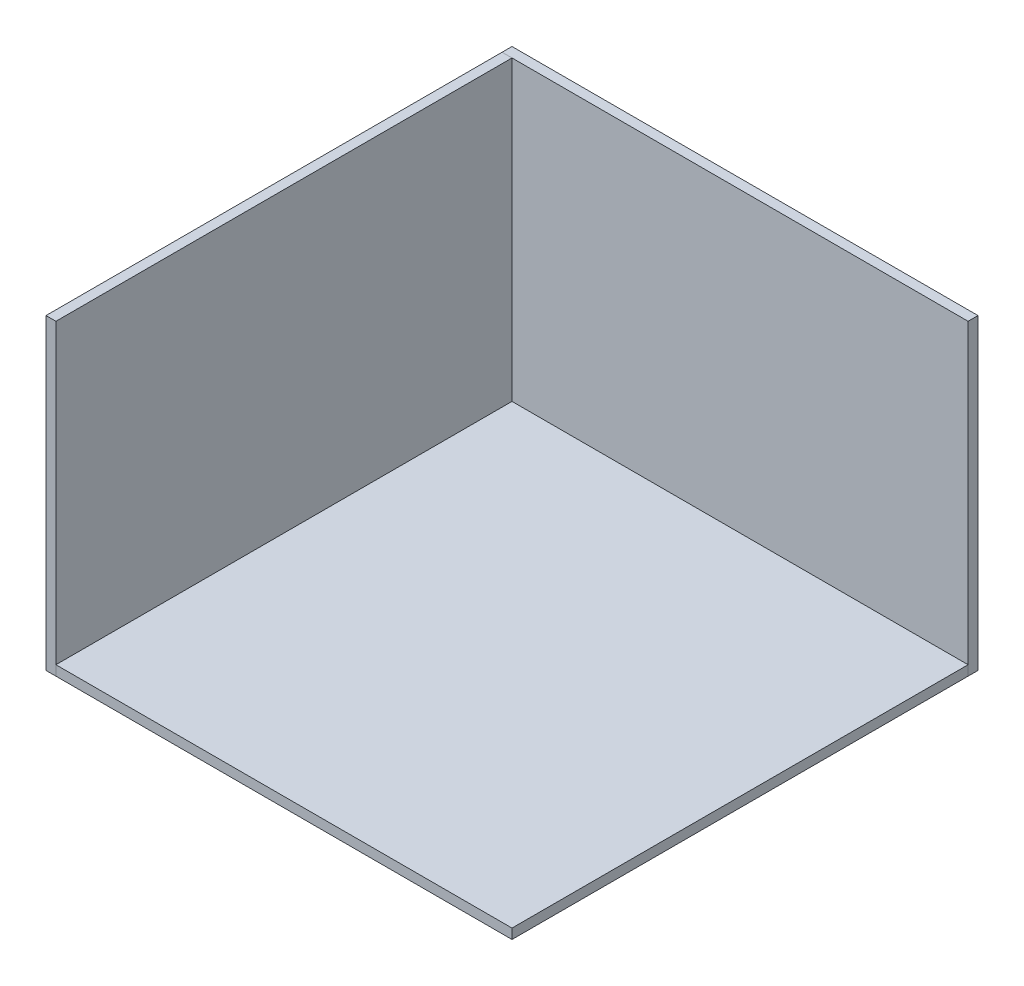
ISO-10303-21;
HEADER;
FILE_DESCRIPTION(('STEP AP214'),'2;1');
FILE_NAME('part.step','',(''),(''),'','','');
FILE_SCHEMA(('AUTOMOTIVE_DESIGN { 1 0 10303 214 1 1 1 1 }'));
ENDSEC;
DATA;
#1=APPLICATION_CONTEXT('core data for automotive mechanical design processes');
#2=APPLICATION_PROTOCOL_DEFINITION('international standard','automotive_design',2000,#1);
#3=PRODUCT_CONTEXT('',#1,'mechanical');
#4=PRODUCT('Part','Part','',(#3));
#5=PRODUCT_RELATED_PRODUCT_CATEGORY('part','',(#4));
#6=PRODUCT_DEFINITION_FORMATION('','',#4);
#7=PRODUCT_DEFINITION_CONTEXT('part definition',#1,'design');
#8=PRODUCT_DEFINITION('design','',#6,#7);
#9=PRODUCT_DEFINITION_SHAPE('','',#8);
#10=(LENGTH_UNIT() NAMED_UNIT(*) SI_UNIT(.MILLI.,.METRE.));
#11=(NAMED_UNIT(*) PLANE_ANGLE_UNIT() SI_UNIT($,.RADIAN.));
#12=(NAMED_UNIT(*) SI_UNIT($,.STERADIAN.) SOLID_ANGLE_UNIT());
#13=UNCERTAINTY_MEASURE_WITH_UNIT(LENGTH_MEASURE(1.E-05),#10,'distance_accuracy_value','');
#14=(GEOMETRIC_REPRESENTATION_CONTEXT(3) GLOBAL_UNCERTAINTY_ASSIGNED_CONTEXT((#13)) GLOBAL_UNIT_ASSIGNED_CONTEXT((#10,
#11,#12)) REPRESENTATION_CONTEXT('',''));
#15=CARTESIAN_POINT('',(0.,0.,0.));
#16=DIRECTION('',(0.,0.,1.));
#17=DIRECTION('',(1.,0.,0.));
#18=AXIS2_PLACEMENT_3D('',#15,#16,#17);
#19=CARTESIAN_POINT('',(-50.,1500.,0.));
#20=DIRECTION('',(-1.,0.,0.));
#21=DIRECTION('',(0.,0.,1.));
#22=AXIS2_PLACEMENT_3D('',#19,#20,#21);
#23=PLANE('',#22);
#24=DIRECTION('',(0.,0.,-1.));
#25=VECTOR('',#24,1.);
#26=CARTESIAN_POINT('',(-50.,-50.,0.));
#27=LINE('',#26,#25);
#28=CARTESIAN_POINT('',(-50.,-50.,2300.));
#29=VERTEX_POINT('',#28);
#30=CARTESIAN_POINT('',(-50.,-50.,0.));
#31=VERTEX_POINT('',#30);
#32=EDGE_CURVE('E109',#29,#31,#27,.T.);
#33=ORIENTED_EDGE('',*,*,#32,.F.);
#34=DIRECTION('',(0.,-1.,0.));
#35=VECTOR('',#34,1.);
#36=CARTESIAN_POINT('',(-50.,1500.,2300.));
#37=LINE('',#36,#35);
#38=CARTESIAN_POINT('',(-50.,1500.,2300.));
#39=VERTEX_POINT('',#38);
#40=EDGE_CURVE('E12',#39,#29,#37,.T.);
#41=ORIENTED_EDGE('',*,*,#40,.F.);
#42=DIRECTION('',(0.,0.,-1.));
#43=VECTOR('',#42,1.);
#44=CARTESIAN_POINT('',(-50.,1500.,0.));
#45=LINE('',#44,#43);
#46=CARTESIAN_POINT('',(-50.,1500.,0.));
#47=VERTEX_POINT('',#46);
#48=EDGE_CURVE('E103',#39,#47,#45,.T.);
#49=ORIENTED_EDGE('',*,*,#48,.T.);
#50=DIRECTION('',(0.,-1.,0.));
#51=VECTOR('',#50,1.);
#52=CARTESIAN_POINT('',(-50.,1500.,0.));
#53=LINE('',#52,#51);
#54=EDGE_CURVE('E48',#47,#31,#53,.T.);
#55=ORIENTED_EDGE('',*,*,#54,.T.);
#56=EDGE_LOOP('',(#33,#41,#49,#55));
#57=FACE_BOUND('',#56,.T.);
#58=ADVANCED_FACE('F45',(#57),#23,.T.);
#59=CARTESIAN_POINT('',(-50.,1500.,2300.));
#60=DIRECTION('',(0.,0.,1.));
#61=DIRECTION('',(1.,0.,0.));
#62=AXIS2_PLACEMENT_3D('',#59,#60,#61);
#63=PLANE('',#62);
#64=DIRECTION('',(-1.,0.,0.));
#65=VECTOR('',#64,1.);
#66=CARTESIAN_POINT('',(-50.,-50.,2300.));
#67=LINE('',#66,#65);
#68=CARTESIAN_POINT('',(2.81668763803891E-13,-50.,2300.));
#69=VERTEX_POINT('',#68);
#70=EDGE_CURVE('E105',#69,#29,#67,.T.);
#71=ORIENTED_EDGE('',*,*,#70,.F.);
#72=DIRECTION('',(0.,-1.,0.));
#73=VECTOR('',#72,1.);
#74=CARTESIAN_POINT('',(2.81668763803891E-13,1500.,2300.));
#75=LINE('',#74,#73);
#76=CARTESIAN_POINT('',(2.81668763803891E-13,1500.,2300.));
#77=VERTEX_POINT('',#76);
#78=EDGE_CURVE('E54',#77,#69,#75,.T.);
#79=ORIENTED_EDGE('',*,*,#78,.F.);
#80=DIRECTION('',(-1.,0.,0.));
#81=VECTOR('',#80,1.);
#82=CARTESIAN_POINT('',(-50.,1500.,2300.));
#83=LINE('',#82,#81);
#84=EDGE_CURVE('E100',#77,#39,#83,.T.);
#85=ORIENTED_EDGE('',*,*,#84,.T.);
#86=ORIENTED_EDGE('',*,*,#40,.T.);
#87=EDGE_LOOP('',(#71,#79,#85,#86));
#88=FACE_BOUND('',#87,.T.);
#89=ADVANCED_FACE('F119',(#88),#63,.T.);
#90=CARTESIAN_POINT('',(2.44929359829471E-13,1500.,0.));
#91=DIRECTION('',(1.,0.,0.));
#92=DIRECTION('',(0.,0.,-1.));
#93=AXIS2_PLACEMENT_3D('',#90,#91,#92);
#94=PLANE('',#93);
#95=DIRECTION('',(0.,0.,1.));
#96=VECTOR('',#95,1.);
#97=CARTESIAN_POINT('',(2.44929359829471E-13,-50.,0.));
#98=LINE('',#97,#96);
#99=CARTESIAN_POINT('',(2.44929359829471E-13,-50.,0.));
#100=VERTEX_POINT('',#99);
#101=EDGE_CURVE('E95',#100,#69,#98,.T.);
#102=ORIENTED_EDGE('',*,*,#101,.F.);
#103=DIRECTION('',(0.,-1.,0.));
#104=VECTOR('',#103,1.);
#105=CARTESIAN_POINT('',(2.44929359829471E-13,1500.,0.));
#106=LINE('',#105,#104);
#107=CARTESIAN_POINT('',(2.44929359829471E-13,1500.,0.));
#108=VERTEX_POINT('',#107);
#109=EDGE_CURVE('E90',#108,#100,#106,.T.);
#110=ORIENTED_EDGE('',*,*,#109,.F.);
#111=DIRECTION('',(0.,0.,1.));
#112=VECTOR('',#111,1.);
#113=CARTESIAN_POINT('',(2.44929359829471E-13,1500.,0.));
#114=LINE('',#113,#112);
#115=EDGE_CURVE('E93',#108,#77,#114,.T.);
#116=ORIENTED_EDGE('',*,*,#115,.T.);
#117=ORIENTED_EDGE('',*,*,#78,.T.);
#118=EDGE_LOOP('',(#102,#110,#116,#117));
#119=FACE_BOUND('',#118,.T.);
#120=ADVANCED_FACE('F92',(#119),#94,.T.);
#121=CARTESIAN_POINT('',(-50.,1500.,0.));
#122=DIRECTION('',(0.,0.,-1.));
#123=DIRECTION('',(-1.,0.,0.));
#124=AXIS2_PLACEMENT_3D('',#121,#122,#123);
#125=PLANE('',#124);
#126=DIRECTION('',(1.,0.,0.));
#127=VECTOR('',#126,1.);
#128=CARTESIAN_POINT('',(-50.,-50.,0.));
#129=LINE('',#128,#127);
#130=EDGE_CURVE('E112',#31,#100,#129,.T.);
#131=ORIENTED_EDGE('',*,*,#130,.F.);
#132=ORIENTED_EDGE('',*,*,#54,.F.);
#133=DIRECTION('',(1.,0.,0.));
#134=VECTOR('',#133,1.);
#135=CARTESIAN_POINT('',(-50.,1500.,0.));
#136=LINE('',#135,#134);
#137=EDGE_CURVE('E99',#47,#108,#136,.T.);
#138=ORIENTED_EDGE('',*,*,#137,.T.);
#139=ORIENTED_EDGE('',*,*,#109,.T.);
#140=EDGE_LOOP('',(#131,#132,#138,#139));
#141=FACE_BOUND('',#140,.T.);
#142=ADVANCED_FACE('F102',(#141),#125,.T.);
#143=CARTESIAN_POINT('',(0.,1500.,0.));
#144=DIRECTION('',(0.,1.,0.));
#145=DIRECTION('',(0.,0.,1.));
#146=AXIS2_PLACEMENT_3D('',#143,#144,#145);
#147=PLANE('',#146);
#148=ORIENTED_EDGE('',*,*,#48,.F.);
#149=ORIENTED_EDGE('',*,*,#84,.F.);
#150=ORIENTED_EDGE('',*,*,#115,.F.);
#151=ORIENTED_EDGE('',*,*,#137,.F.);
#152=EDGE_LOOP('',(#148,#149,#150,#151));
#153=FACE_BOUND('',#152,.T.);
#154=ADVANCED_FACE('F98',(#153),#147,.T.);
#155=CARTESIAN_POINT('',(0.,-50.,0.));
#156=DIRECTION('',(0.,1.,0.));
#157=DIRECTION('',(0.,0.,1.));
#158=AXIS2_PLACEMENT_3D('',#155,#156,#157);
#159=PLANE('',#158);
#160=ORIENTED_EDGE('',*,*,#32,.T.);
#161=ORIENTED_EDGE('',*,*,#130,.T.);
#162=ORIENTED_EDGE('',*,*,#101,.T.);
#163=ORIENTED_EDGE('',*,*,#70,.T.);
#164=EDGE_LOOP('',(#160,#161,#162,#163));
#165=FACE_BOUND('',#164,.T.);
#166=ADVANCED_FACE('F118',(#165),#159,.F.);
#167=CLOSED_SHELL('',(#58,#89,#120,#142,#154,#166));
#168=MANIFOLD_SOLID_BREP('B2',#167);
#169=CARTESIAN_POINT('',(0.,1500.,0.));
#170=DIRECTION('',(0.,0.,1.));
#171=DIRECTION('',(1.,0.,0.));
#172=AXIS2_PLACEMENT_3D('',#169,#170,#171);
#173=PLANE('',#172);
#174=DIRECTION('',(-1.,0.,0.));
#175=VECTOR('',#174,1.);
#176=CARTESIAN_POINT('',(0.,-50.,0.));
#177=LINE('',#176,#175);
#178=CARTESIAN_POINT('',(2300.,-50.,0.));
#179=VERTEX_POINT('',#178);
#180=CARTESIAN_POINT('',(-50.,-50.,0.));
#181=VERTEX_POINT('',#180);
#182=EDGE_CURVE('E239',#179,#181,#177,.T.);
#183=ORIENTED_EDGE('',*,*,#182,.F.);
#184=DIRECTION('',(0.,-1.,0.));
#185=VECTOR('',#184,1.);
#186=CARTESIAN_POINT('',(2300.,1500.,0.));
#187=LINE('',#186,#185);
#188=CARTESIAN_POINT('',(2300.,1500.,0.));
#189=VERTEX_POINT('',#188);
#190=EDGE_CURVE('E43',#189,#179,#187,.T.);
#191=ORIENTED_EDGE('',*,*,#190,.F.);
#192=DIRECTION('',(-1.,0.,0.));
#193=VECTOR('',#192,1.);
#194=CARTESIAN_POINT('',(-50.,1500.,0.));
#195=LINE('',#194,#193);
#196=CARTESIAN_POINT('',(-50.,1500.,0.));
#197=VERTEX_POINT('',#196);
#198=EDGE_CURVE('E198',#189,#197,#195,.T.);
#199=ORIENTED_EDGE('',*,*,#198,.T.);
#200=DIRECTION('',(0.,-1.,0.));
#201=VECTOR('',#200,1.);
#202=CARTESIAN_POINT('',(-50.,1500.,0.));
#203=LINE('',#202,#201);
#204=EDGE_CURVE('E183',#197,#181,#203,.T.);
#205=ORIENTED_EDGE('',*,*,#204,.T.);
#206=EDGE_LOOP('',(#183,#191,#199,#205));
#207=FACE_BOUND('',#206,.T.);
#208=ADVANCED_FACE('F179',(#207),#173,.T.);
#209=CARTESIAN_POINT('',(2300.,1500.,0.));
#210=DIRECTION('',(1.,0.,0.));
#211=DIRECTION('',(0.,0.,-1.));
#212=AXIS2_PLACEMENT_3D('',#209,#210,#211);
#213=PLANE('',#212);
#214=DIRECTION('',(0.,0.,1.));
#215=VECTOR('',#214,1.);
#216=CARTESIAN_POINT('',(2300.,-50.,0.));
#217=LINE('',#216,#215);
#218=CARTESIAN_POINT('',(2300.,-50.,-50.));
#219=VERTEX_POINT('',#218);
#220=EDGE_CURVE('E246',#219,#179,#217,.T.);
#221=ORIENTED_EDGE('',*,*,#220,.F.);
#222=DIRECTION('',(0.,-1.,0.));
#223=VECTOR('',#222,1.);
#224=CARTESIAN_POINT('',(2300.,1500.,-50.));
#225=LINE('',#224,#223);
#226=CARTESIAN_POINT('',(2300.,1500.,-50.));
#227=VERTEX_POINT('',#226);
#228=EDGE_CURVE('E189',#227,#219,#225,.T.);
#229=ORIENTED_EDGE('',*,*,#228,.F.);
#230=DIRECTION('',(0.,0.,1.));
#231=VECTOR('',#230,1.);
#232=CARTESIAN_POINT('',(2300.,1500.,0.));
#233=LINE('',#232,#231);
#234=EDGE_CURVE('E236',#227,#189,#233,.T.);
#235=ORIENTED_EDGE('',*,*,#234,.T.);
#236=ORIENTED_EDGE('',*,*,#190,.T.);
#237=EDGE_LOOP('',(#221,#229,#235,#236));
#238=FACE_BOUND('',#237,.T.);
#239=ADVANCED_FACE('F253',(#238),#213,.T.);
#240=CARTESIAN_POINT('',(2300.,1500.,-50.));
#241=DIRECTION('',(0.,0.,-1.));
#242=DIRECTION('',(-1.,0.,0.));
#243=AXIS2_PLACEMENT_3D('',#240,#241,#242);
#244=PLANE('',#243);
#245=DIRECTION('',(1.,0.,0.));
#246=VECTOR('',#245,1.);
#247=CARTESIAN_POINT('',(2300.,-50.,-50.));
#248=LINE('',#247,#246);
#249=CARTESIAN_POINT('',(-49.9999999999998,-50.,-50.0000000000002));
#250=VERTEX_POINT('',#249);
#251=EDGE_CURVE('E232',#250,#219,#248,.T.);
#252=ORIENTED_EDGE('',*,*,#251,.F.);
#253=DIRECTION('',(0.,-1.,0.));
#254=VECTOR('',#253,1.);
#255=CARTESIAN_POINT('',(-49.9999999999998,1500.,-50.0000000000002));
#256=LINE('',#255,#254);
#257=CARTESIAN_POINT('',(-49.9999999999998,1500.,-50.0000000000002));
#258=VERTEX_POINT('',#257);
#259=EDGE_CURVE('E227',#258,#250,#256,.T.);
#260=ORIENTED_EDGE('',*,*,#259,.F.);
#261=DIRECTION('',(1.,0.,0.));
#262=VECTOR('',#261,1.);
#263=CARTESIAN_POINT('',(2300.,1500.,-50.));
#264=LINE('',#263,#262);
#265=EDGE_CURVE('E230',#258,#227,#264,.T.);
#266=ORIENTED_EDGE('',*,*,#265,.T.);
#267=ORIENTED_EDGE('',*,*,#228,.T.);
#268=EDGE_LOOP('',(#252,#260,#266,#267));
#269=FACE_BOUND('',#268,.T.);
#270=ADVANCED_FACE('F229',(#269),#244,.T.);
#271=CARTESIAN_POINT('',(-49.9999999999998,1500.,-50.0000000000002));
#272=DIRECTION('',(-1.,0.,0.));
#273=DIRECTION('',(0.,0.,1.));
#274=AXIS2_PLACEMENT_3D('',#271,#272,#273);
#275=PLANE('',#274);
#276=DIRECTION('',(0.,0.,-1.));
#277=VECTOR('',#276,1.);
#278=CARTESIAN_POINT('',(-49.9999999999998,-50.,-50.0000000000002));
#279=LINE('',#278,#277);
#280=EDGE_CURVE('E243',#181,#250,#279,.T.);
#281=ORIENTED_EDGE('',*,*,#280,.F.);
#282=ORIENTED_EDGE('',*,*,#204,.F.);
#283=DIRECTION('',(0.,0.,-1.));
#284=VECTOR('',#283,1.);
#285=CARTESIAN_POINT('',(-49.9999999999998,1500.,-50.0000000000002));
#286=LINE('',#285,#284);
#287=EDGE_CURVE('E235',#197,#258,#286,.T.);
#288=ORIENTED_EDGE('',*,*,#287,.T.);
#289=ORIENTED_EDGE('',*,*,#259,.T.);
#290=EDGE_LOOP('',(#281,#282,#288,#289));
#291=FACE_BOUND('',#290,.T.);
#292=ADVANCED_FACE('F181',(#291),#275,.T.);
#293=CARTESIAN_POINT('',(0.,1500.,0.));
#294=DIRECTION('',(0.,1.,0.));
#295=DIRECTION('',(0.,0.,1.));
#296=AXIS2_PLACEMENT_3D('',#293,#294,#295);
#297=PLANE('',#296);
#298=ORIENTED_EDGE('',*,*,#198,.F.);
#299=ORIENTED_EDGE('',*,*,#234,.F.);
#300=ORIENTED_EDGE('',*,*,#265,.F.);
#301=ORIENTED_EDGE('',*,*,#287,.F.);
#302=EDGE_LOOP('',(#298,#299,#300,#301));
#303=FACE_BOUND('',#302,.T.);
#304=ADVANCED_FACE('F234',(#303),#297,.T.);
#305=CARTESIAN_POINT('',(0.,-50.,0.));
#306=DIRECTION('',(0.,1.,0.));
#307=DIRECTION('',(0.,0.,1.));
#308=AXIS2_PLACEMENT_3D('',#305,#306,#307);
#309=PLANE('',#308);
#310=ORIENTED_EDGE('',*,*,#182,.T.);
#311=ORIENTED_EDGE('',*,*,#280,.T.);
#312=ORIENTED_EDGE('',*,*,#251,.T.);
#313=ORIENTED_EDGE('',*,*,#220,.T.);
#314=EDGE_LOOP('',(#310,#311,#312,#313));
#315=FACE_BOUND('',#314,.T.);
#316=ADVANCED_FACE('F251',(#315),#309,.F.);
#317=CLOSED_SHELL('',(#208,#239,#270,#292,#304,#316));
#318=MANIFOLD_SOLID_BREP('B6',#317);
#319=CARTESIAN_POINT('',(0.,-50.,0.));
#320=DIRECTION('',(-1.,0.,0.));
#321=DIRECTION('',(0.,0.,1.));
#322=AXIS2_PLACEMENT_3D('',#319,#320,#321);
#323=PLANE('',#322);
#324=DIRECTION('',(0.,0.,1.));
#325=VECTOR('',#324,1.);
#326=CARTESIAN_POINT('',(0.,0.,0.));
#327=LINE('',#326,#325);
#328=CARTESIAN_POINT('',(0.,0.,0.));
#329=VERTEX_POINT('',#328);
#330=CARTESIAN_POINT('',(2.81668763803891E-13,0.,2300.));
#331=VERTEX_POINT('',#330);
#332=EDGE_CURVE('E373',#329,#331,#327,.T.);
#333=ORIENTED_EDGE('',*,*,#332,.F.);
#334=DIRECTION('',(0.,1.,0.));
#335=VECTOR('',#334,1.);
#336=CARTESIAN_POINT('',(0.,-50.,0.));
#337=LINE('',#336,#335);
#338=CARTESIAN_POINT('',(0.,-50.,0.));
#339=VERTEX_POINT('',#338);
#340=EDGE_CURVE('E177',#339,#329,#337,.T.);
#341=ORIENTED_EDGE('',*,*,#340,.F.);
#342=DIRECTION('',(0.,0.,1.));
#343=VECTOR('',#342,1.);
#344=CARTESIAN_POINT('',(0.,-50.,0.));
#345=LINE('',#344,#343);
#346=CARTESIAN_POINT('',(2.81668763803891E-13,-50.,2300.));
#347=VERTEX_POINT('',#346);
#348=EDGE_CURVE('E367',#339,#347,#345,.T.);
#349=ORIENTED_EDGE('',*,*,#348,.T.);
#350=DIRECTION('',(0.,1.,0.));
#351=VECTOR('',#350,1.);
#352=CARTESIAN_POINT('',(2.81668763803891E-13,-50.,2300.));
#353=LINE('',#352,#351);
#354=EDGE_CURVE('E312',#347,#331,#353,.T.);
#355=ORIENTED_EDGE('',*,*,#354,.T.);
#356=EDGE_LOOP('',(#333,#341,#349,#355));
#357=FACE_BOUND('',#356,.T.);
#358=ADVANCED_FACE('F309',(#357),#323,.T.);
#359=CARTESIAN_POINT('',(0.,-50.,0.));
#360=DIRECTION('',(0.,0.,-1.));
#361=DIRECTION('',(-1.,0.,0.));
#362=AXIS2_PLACEMENT_3D('',#359,#360,#361);
#363=PLANE('',#362);
#364=DIRECTION('',(-1.,0.,0.));
#365=VECTOR('',#364,1.);
#366=CARTESIAN_POINT('',(0.,0.,0.));
#367=LINE('',#366,#365);
#368=CARTESIAN_POINT('',(2300.,0.,0.));
#369=VERTEX_POINT('',#368);
#370=EDGE_CURVE('E369',#369,#329,#367,.T.);
#371=ORIENTED_EDGE('',*,*,#370,.F.);
#372=DIRECTION('',(0.,1.,0.));
#373=VECTOR('',#372,1.);
#374=CARTESIAN_POINT('',(2300.,-50.,0.));
#375=LINE('',#374,#373);
#376=CARTESIAN_POINT('',(2300.,-50.,0.));
#377=VERTEX_POINT('',#376);
#378=EDGE_CURVE('E318',#377,#369,#375,.T.);
#379=ORIENTED_EDGE('',*,*,#378,.F.);
#380=DIRECTION('',(-1.,0.,0.));
#381=VECTOR('',#380,1.);
#382=CARTESIAN_POINT('',(0.,-50.,0.));
#383=LINE('',#382,#381);
#384=EDGE_CURVE('E364',#377,#339,#383,.T.);
#385=ORIENTED_EDGE('',*,*,#384,.T.);
#386=ORIENTED_EDGE('',*,*,#340,.T.);
#387=EDGE_LOOP('',(#371,#379,#385,#386));
#388=FACE_BOUND('',#387,.T.);
#389=ADVANCED_FACE('F383',(#388),#363,.T.);
#390=CARTESIAN_POINT('',(2300.,-50.,0.));
#391=DIRECTION('',(1.,0.,0.));
#392=DIRECTION('',(0.,0.,-1.));
#393=AXIS2_PLACEMENT_3D('',#390,#391,#392);
#394=PLANE('',#393);
#395=DIRECTION('',(0.,0.,-1.));
#396=VECTOR('',#395,1.);
#397=CARTESIAN_POINT('',(2300.,0.,0.));
#398=LINE('',#397,#396);
#399=CARTESIAN_POINT('',(2300.,0.,2300.));
#400=VERTEX_POINT('',#399);
#401=EDGE_CURVE('E359',#400,#369,#398,.T.);
#402=ORIENTED_EDGE('',*,*,#401,.F.);
#403=DIRECTION('',(0.,1.,0.));
#404=VECTOR('',#403,1.);
#405=CARTESIAN_POINT('',(2300.,-50.,2300.));
#406=LINE('',#405,#404);
#407=CARTESIAN_POINT('',(2300.,-50.,2300.));
#408=VERTEX_POINT('',#407);
#409=EDGE_CURVE('E354',#408,#400,#406,.T.);
#410=ORIENTED_EDGE('',*,*,#409,.F.);
#411=DIRECTION('',(0.,0.,-1.));
#412=VECTOR('',#411,1.);
#413=CARTESIAN_POINT('',(2300.,-50.,0.));
#414=LINE('',#413,#412);
#415=EDGE_CURVE('E357',#408,#377,#414,.T.);
#416=ORIENTED_EDGE('',*,*,#415,.T.);
#417=ORIENTED_EDGE('',*,*,#378,.T.);
#418=EDGE_LOOP('',(#402,#410,#416,#417));
#419=FACE_BOUND('',#418,.T.);
#420=ADVANCED_FACE('F356',(#419),#394,.T.);
#421=CARTESIAN_POINT('',(2.81668763803891E-13,-50.,2300.));
#422=DIRECTION('',(0.,0.,1.));
#423=DIRECTION('',(1.,0.,0.));
#424=AXIS2_PLACEMENT_3D('',#421,#422,#423);
#425=PLANE('',#424);
#426=DIRECTION('',(1.,0.,0.));
#427=VECTOR('',#426,1.);
#428=CARTESIAN_POINT('',(2.81668763803891E-13,0.,2300.));
#429=LINE('',#428,#427);
#430=EDGE_CURVE('E376',#331,#400,#429,.T.);
#431=ORIENTED_EDGE('',*,*,#430,.F.);
#432=ORIENTED_EDGE('',*,*,#354,.F.);
#433=DIRECTION('',(1.,0.,0.));
#434=VECTOR('',#433,1.);
#435=CARTESIAN_POINT('',(2.81668763803891E-13,-50.,2300.));
#436=LINE('',#435,#434);
#437=EDGE_CURVE('E363',#347,#408,#436,.T.);
#438=ORIENTED_EDGE('',*,*,#437,.T.);
#439=ORIENTED_EDGE('',*,*,#409,.T.);
#440=EDGE_LOOP('',(#431,#432,#438,#439));
#441=FACE_BOUND('',#440,.T.);
#442=ADVANCED_FACE('F366',(#441),#425,.T.);
#443=CARTESIAN_POINT('',(0.,-50.,0.));
#444=DIRECTION('',(0.,1.,0.));
#445=DIRECTION('',(0.,0.,1.));
#446=AXIS2_PLACEMENT_3D('',#443,#444,#445);
#447=PLANE('',#446);
#448=ORIENTED_EDGE('',*,*,#348,.F.);
#449=ORIENTED_EDGE('',*,*,#384,.F.);
#450=ORIENTED_EDGE('',*,*,#415,.F.);
#451=ORIENTED_EDGE('',*,*,#437,.F.);
#452=EDGE_LOOP('',(#448,#449,#450,#451));
#453=FACE_BOUND('',#452,.T.);
#454=ADVANCED_FACE('F362',(#453),#447,.F.);
#455=CARTESIAN_POINT('',(0.,0.,0.));
#456=DIRECTION('',(0.,1.,0.));
#457=DIRECTION('',(0.,0.,1.));
#458=AXIS2_PLACEMENT_3D('',#455,#456,#457);
#459=PLANE('',#458);
#460=ORIENTED_EDGE('',*,*,#332,.T.);
#461=ORIENTED_EDGE('',*,*,#430,.T.);
#462=ORIENTED_EDGE('',*,*,#401,.T.);
#463=ORIENTED_EDGE('',*,*,#370,.T.);
#464=EDGE_LOOP('',(#460,#461,#462,#463));
#465=FACE_BOUND('',#464,.T.);
#466=ADVANCED_FACE('F382',(#465),#459,.T.);
#467=CLOSED_SHELL('',(#358,#389,#420,#442,#454,#466));
#468=MANIFOLD_SOLID_BREP('B37',#467);
#469=ADVANCED_BREP_SHAPE_REPRESENTATION('',(#18,#168,#318,#468),#14);
#470=SHAPE_DEFINITION_REPRESENTATION(#9,#469);
ENDSEC;
END-ISO-10303-21;
